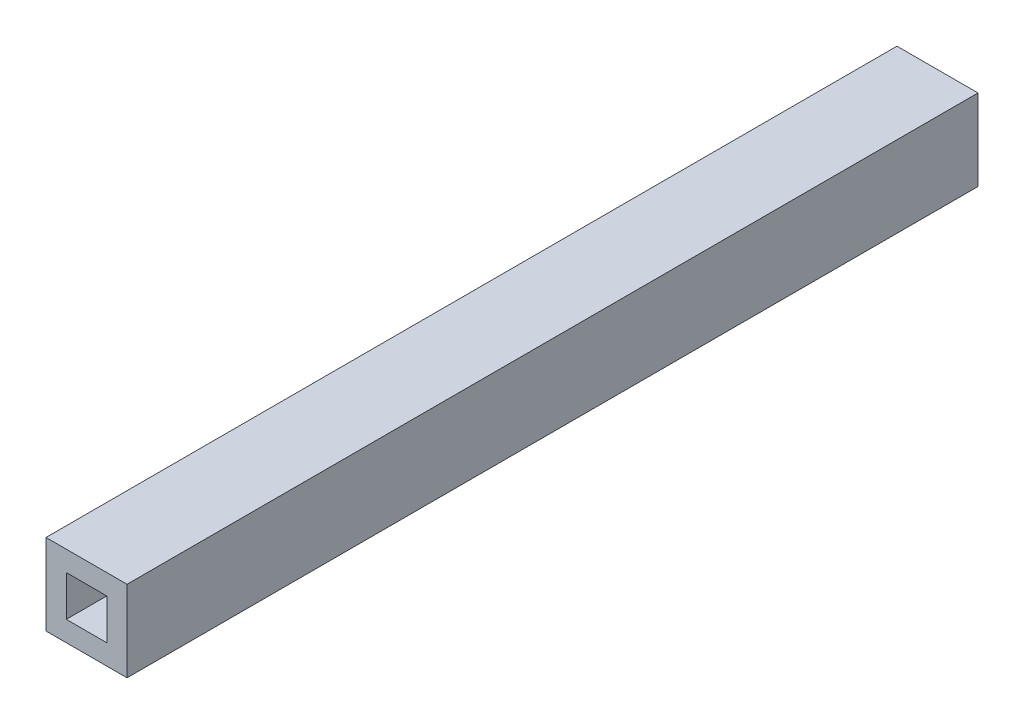
ISO-10303-21;
HEADER;
FILE_DESCRIPTION(('STEP AP214'),'2;1');
FILE_NAME('part.step','',(''),(''),'','','');
FILE_SCHEMA(('AUTOMOTIVE_DESIGN { 1 0 10303 214 1 1 1 1 }'));
ENDSEC;
DATA;
#1=APPLICATION_CONTEXT('core data for automotive mechanical design processes');
#2=APPLICATION_PROTOCOL_DEFINITION('international standard','automotive_design',2000,#1);
#3=PRODUCT_CONTEXT('',#1,'mechanical');
#4=PRODUCT('Part','Part','',(#3));
#5=PRODUCT_RELATED_PRODUCT_CATEGORY('part','',(#4));
#6=PRODUCT_DEFINITION_FORMATION('','',#4);
#7=PRODUCT_DEFINITION_CONTEXT('part definition',#1,'design');
#8=PRODUCT_DEFINITION('design','',#6,#7);
#9=PRODUCT_DEFINITION_SHAPE('','',#8);
#10=(LENGTH_UNIT() NAMED_UNIT(*) SI_UNIT(.MILLI.,.METRE.));
#11=(NAMED_UNIT(*) PLANE_ANGLE_UNIT() SI_UNIT($,.RADIAN.));
#12=(NAMED_UNIT(*) SI_UNIT($,.STERADIAN.) SOLID_ANGLE_UNIT());
#13=UNCERTAINTY_MEASURE_WITH_UNIT(LENGTH_MEASURE(1.E-05),#10,'distance_accuracy_value','');
#14=(GEOMETRIC_REPRESENTATION_CONTEXT(3) GLOBAL_UNCERTAINTY_ASSIGNED_CONTEXT((#13)) GLOBAL_UNIT_ASSIGNED_CONTEXT((#10,
#11,#12)) REPRESENTATION_CONTEXT('',''));
#15=CARTESIAN_POINT('',(0.,0.,0.));
#16=DIRECTION('',(0.,0.,1.));
#17=DIRECTION('',(1.,0.,0.));
#18=AXIS2_PLACEMENT_3D('',#15,#16,#17);
#19=CARTESIAN_POINT('',(0.,0.,210.));
#20=DIRECTION('',(0.,0.,1.));
#21=DIRECTION('',(1.,0.,0.));
#22=AXIS2_PLACEMENT_3D('',#19,#20,#21);
#23=PLANE('',#22);
#24=DIRECTION('',(0.,1.,0.));
#25=VECTOR('',#24,1.);
#26=CARTESIAN_POINT('',(10.,-10.,210.));
#27=LINE('',#26,#25);
#28=CARTESIAN_POINT('',(10.,-10.,210.));
#29=VERTEX_POINT('',#28);
#30=CARTESIAN_POINT('',(10.,10.,210.));
#31=VERTEX_POINT('',#30);
#32=EDGE_CURVE('E158',#29,#31,#27,.T.);
#33=ORIENTED_EDGE('',*,*,#32,.T.);
#34=DIRECTION('',(-1.,0.,0.));
#35=VECTOR('',#34,1.);
#36=CARTESIAN_POINT('',(-10.,10.,210.));
#37=LINE('',#36,#35);
#38=CARTESIAN_POINT('',(-10.,10.,210.));
#39=VERTEX_POINT('',#38);
#40=EDGE_CURVE('E161',#31,#39,#37,.T.);
#41=ORIENTED_EDGE('',*,*,#40,.T.);
#42=DIRECTION('',(0.,-1.,0.));
#43=VECTOR('',#42,1.);
#44=CARTESIAN_POINT('',(-10.,-10.,210.));
#45=LINE('',#44,#43);
#46=CARTESIAN_POINT('',(-10.,-10.,210.));
#47=VERTEX_POINT('',#46);
#48=EDGE_CURVE('E164',#39,#47,#45,.T.);
#49=ORIENTED_EDGE('',*,*,#48,.T.);
#50=DIRECTION('',(1.,0.,0.));
#51=VECTOR('',#50,1.);
#52=CARTESIAN_POINT('',(-10.,-10.,210.));
#53=LINE('',#52,#51);
#54=EDGE_CURVE('E166',#47,#29,#53,.T.);
#55=ORIENTED_EDGE('',*,*,#54,.T.);
#56=EDGE_LOOP('',(#33,#41,#49,#55));
#57=FACE_BOUND('',#56,.T.);
#58=DIRECTION('',(-1.,0.,0.));
#59=VECTOR('',#58,1.);
#60=CARTESIAN_POINT('',(0.,5.,210.));
#61=LINE('',#60,#59);
#62=CARTESIAN_POINT('',(5.,5.,210.));
#63=VERTEX_POINT('',#62);
#64=CARTESIAN_POINT('',(-5.,5.,210.));
#65=VERTEX_POINT('',#64);
#66=EDGE_CURVE('E130',#63,#65,#61,.T.);
#67=ORIENTED_EDGE('',*,*,#66,.F.);
#68=DIRECTION('',(0.,1.,0.));
#69=VECTOR('',#68,1.);
#70=CARTESIAN_POINT('',(5.,0.,210.));
#71=LINE('',#70,#69);
#72=CARTESIAN_POINT('',(5.,-5.,210.));
#73=VERTEX_POINT('',#72);
#74=EDGE_CURVE('E122',#73,#63,#71,.T.);
#75=ORIENTED_EDGE('',*,*,#74,.F.);
#76=DIRECTION('',(1.,0.,0.));
#77=VECTOR('',#76,1.);
#78=CARTESIAN_POINT('',(0.,-5.,210.));
#79=LINE('',#78,#77);
#80=CARTESIAN_POINT('',(-5.,-5.,210.));
#81=VERTEX_POINT('',#80);
#82=EDGE_CURVE('E144',#81,#73,#79,.T.);
#83=ORIENTED_EDGE('',*,*,#82,.F.);
#84=DIRECTION('',(0.,-1.,0.));
#85=VECTOR('',#84,1.);
#86=CARTESIAN_POINT('',(-5.,0.,210.));
#87=LINE('',#86,#85);
#88=EDGE_CURVE('E142',#65,#81,#87,.T.);
#89=ORIENTED_EDGE('',*,*,#88,.F.);
#90=EDGE_LOOP('',(#67,#75,#83,#89));
#91=FACE_BOUND('',#90,.T.);
#92=ADVANCED_FACE('F57',(#57,#91),#23,.T.);
#93=CARTESIAN_POINT('',(0.,0.,0.));
#94=DIRECTION('',(0.,0.,1.));
#95=DIRECTION('',(1.,0.,0.));
#96=AXIS2_PLACEMENT_3D('',#93,#94,#95);
#97=PLANE('',#96);
#98=DIRECTION('',(0.,1.,0.));
#99=VECTOR('',#98,1.);
#100=CARTESIAN_POINT('',(10.,-10.,0.));
#101=LINE('',#100,#99);
#102=CARTESIAN_POINT('',(10.,-10.,0.));
#103=VERTEX_POINT('',#102);
#104=CARTESIAN_POINT('',(10.,10.,0.));
#105=VERTEX_POINT('',#104);
#106=EDGE_CURVE('E138',#103,#105,#101,.T.);
#107=ORIENTED_EDGE('',*,*,#106,.F.);
#108=DIRECTION('',(1.,0.,0.));
#109=VECTOR('',#108,1.);
#110=CARTESIAN_POINT('',(-10.,-10.,0.));
#111=LINE('',#110,#109);
#112=CARTESIAN_POINT('',(-10.,-10.,0.));
#113=VERTEX_POINT('',#112);
#114=EDGE_CURVE('E162',#113,#103,#111,.T.);
#115=ORIENTED_EDGE('',*,*,#114,.F.);
#116=DIRECTION('',(0.,-1.,0.));
#117=VECTOR('',#116,1.);
#118=CARTESIAN_POINT('',(-10.,-10.,0.));
#119=LINE('',#118,#117);
#120=CARTESIAN_POINT('',(-10.,10.,0.));
#121=VERTEX_POINT('',#120);
#122=EDGE_CURVE('E173',#121,#113,#119,.T.);
#123=ORIENTED_EDGE('',*,*,#122,.F.);
#124=DIRECTION('',(-1.,0.,0.));
#125=VECTOR('',#124,1.);
#126=CARTESIAN_POINT('',(-10.,10.,0.));
#127=LINE('',#126,#125);
#128=EDGE_CURVE('E171',#105,#121,#127,.T.);
#129=ORIENTED_EDGE('',*,*,#128,.F.);
#130=EDGE_LOOP('',(#107,#115,#123,#129));
#131=FACE_BOUND('',#130,.T.);
#132=DIRECTION('',(0.,1.,0.));
#133=VECTOR('',#132,1.);
#134=CARTESIAN_POINT('',(5.,0.,0.));
#135=LINE('',#134,#133);
#136=CARTESIAN_POINT('',(5.,-5.,0.));
#137=VERTEX_POINT('',#136);
#138=CARTESIAN_POINT('',(5.,5.,0.));
#139=VERTEX_POINT('',#138);
#140=EDGE_CURVE('E80',#137,#139,#135,.T.);
#141=ORIENTED_EDGE('',*,*,#140,.T.);
#142=DIRECTION('',(-1.,0.,0.));
#143=VECTOR('',#142,1.);
#144=CARTESIAN_POINT('',(0.,5.,0.));
#145=LINE('',#144,#143);
#146=CARTESIAN_POINT('',(-5.,5.,0.));
#147=VERTEX_POINT('',#146);
#148=EDGE_CURVE('E137',#139,#147,#145,.T.);
#149=ORIENTED_EDGE('',*,*,#148,.T.);
#150=DIRECTION('',(0.,-1.,0.));
#151=VECTOR('',#150,1.);
#152=CARTESIAN_POINT('',(-5.,0.,0.));
#153=LINE('',#152,#151);
#154=CARTESIAN_POINT('',(-5.,-5.,0.));
#155=VERTEX_POINT('',#154);
#156=EDGE_CURVE('E150',#147,#155,#153,.T.);
#157=ORIENTED_EDGE('',*,*,#156,.T.);
#158=DIRECTION('',(1.,0.,0.));
#159=VECTOR('',#158,1.);
#160=CARTESIAN_POINT('',(0.,-5.,0.));
#161=LINE('',#160,#159);
#162=EDGE_CURVE('E131',#155,#137,#161,.T.);
#163=ORIENTED_EDGE('',*,*,#162,.T.);
#164=EDGE_LOOP('',(#141,#149,#157,#163));
#165=FACE_BOUND('',#164,.T.);
#166=ADVANCED_FACE('F191',(#131,#165),#97,.F.);
#167=CARTESIAN_POINT('',(10.,-10.,210.));
#168=DIRECTION('',(-1.,0.,0.));
#169=DIRECTION('',(0.,0.,1.));
#170=AXIS2_PLACEMENT_3D('',#167,#168,#169);
#171=PLANE('',#170);
#172=ORIENTED_EDGE('',*,*,#106,.T.);
#173=DIRECTION('',(0.,0.,-1.));
#174=VECTOR('',#173,1.);
#175=CARTESIAN_POINT('',(10.,10.,210.));
#176=LINE('',#175,#174);
#177=EDGE_CURVE('E12',#31,#105,#176,.T.);
#178=ORIENTED_EDGE('',*,*,#177,.F.);
#179=ORIENTED_EDGE('',*,*,#32,.F.);
#180=DIRECTION('',(0.,0.,-1.));
#181=VECTOR('',#180,1.);
#182=CARTESIAN_POINT('',(10.,-10.,210.));
#183=LINE('',#182,#181);
#184=EDGE_CURVE('E168',#29,#103,#183,.T.);
#185=ORIENTED_EDGE('',*,*,#184,.T.);
#186=EDGE_LOOP('',(#172,#178,#179,#185));
#187=FACE_BOUND('',#186,.T.);
#188=ADVANCED_FACE('F59',(#187),#171,.F.);
#189=CARTESIAN_POINT('',(-10.,10.,210.));
#190=DIRECTION('',(0.,-1.,0.));
#191=DIRECTION('',(0.,0.,-1.));
#192=AXIS2_PLACEMENT_3D('',#189,#190,#191);
#193=PLANE('',#192);
#194=ORIENTED_EDGE('',*,*,#128,.T.);
#195=DIRECTION('',(0.,0.,-1.));
#196=VECTOR('',#195,1.);
#197=CARTESIAN_POINT('',(-10.,10.,210.));
#198=LINE('',#197,#196);
#199=EDGE_CURVE('E65',#39,#121,#198,.T.);
#200=ORIENTED_EDGE('',*,*,#199,.F.);
#201=ORIENTED_EDGE('',*,*,#40,.F.);
#202=ORIENTED_EDGE('',*,*,#177,.T.);
#203=EDGE_LOOP('',(#194,#200,#201,#202));
#204=FACE_BOUND('',#203,.T.);
#205=ADVANCED_FACE('F201',(#204),#193,.F.);
#206=CARTESIAN_POINT('',(-10.,-10.,210.));
#207=DIRECTION('',(1.,0.,0.));
#208=DIRECTION('',(0.,0.,-1.));
#209=AXIS2_PLACEMENT_3D('',#206,#207,#208);
#210=PLANE('',#209);
#211=ORIENTED_EDGE('',*,*,#122,.T.);
#212=DIRECTION('',(0.,0.,-1.));
#213=VECTOR('',#212,1.);
#214=CARTESIAN_POINT('',(-10.,-10.,210.));
#215=LINE('',#214,#213);
#216=EDGE_CURVE('E178',#47,#113,#215,.T.);
#217=ORIENTED_EDGE('',*,*,#216,.F.);
#218=ORIENTED_EDGE('',*,*,#48,.F.);
#219=ORIENTED_EDGE('',*,*,#199,.T.);
#220=EDGE_LOOP('',(#211,#217,#218,#219));
#221=FACE_BOUND('',#220,.T.);
#222=ADVANCED_FACE('F185',(#221),#210,.F.);
#223=CARTESIAN_POINT('',(-10.,-10.,210.));
#224=DIRECTION('',(0.,1.,0.));
#225=DIRECTION('',(0.,0.,1.));
#226=AXIS2_PLACEMENT_3D('',#223,#224,#225);
#227=PLANE('',#226);
#228=ORIENTED_EDGE('',*,*,#114,.T.);
#229=ORIENTED_EDGE('',*,*,#184,.F.);
#230=ORIENTED_EDGE('',*,*,#54,.F.);
#231=ORIENTED_EDGE('',*,*,#216,.T.);
#232=EDGE_LOOP('',(#228,#229,#230,#231));
#233=FACE_BOUND('',#232,.T.);
#234=ADVANCED_FACE('F195',(#233),#227,.F.);
#235=CARTESIAN_POINT('',(5.,0.,210.));
#236=DIRECTION('',(-1.,0.,0.));
#237=DIRECTION('',(0.,0.,1.));
#238=AXIS2_PLACEMENT_3D('',#235,#236,#237);
#239=PLANE('',#238);
#240=ORIENTED_EDGE('',*,*,#140,.F.);
#241=DIRECTION('',(0.,0.,-1.));
#242=VECTOR('',#241,1.);
#243=CARTESIAN_POINT('',(5.,-5.,210.));
#244=LINE('',#243,#242);
#245=EDGE_CURVE('E126',#73,#137,#244,.T.);
#246=ORIENTED_EDGE('',*,*,#245,.F.);
#247=ORIENTED_EDGE('',*,*,#74,.T.);
#248=DIRECTION('',(0.,0.,-1.));
#249=VECTOR('',#248,1.);
#250=CARTESIAN_POINT('',(5.,5.,210.));
#251=LINE('',#250,#249);
#252=EDGE_CURVE('E125',#63,#139,#251,.T.);
#253=ORIENTED_EDGE('',*,*,#252,.T.);
#254=EDGE_LOOP('',(#240,#246,#247,#253));
#255=FACE_BOUND('',#254,.T.);
#256=ADVANCED_FACE('F124',(#255),#239,.T.);
#257=CARTESIAN_POINT('',(0.,5.,210.));
#258=DIRECTION('',(0.,-1.,0.));
#259=DIRECTION('',(0.,0.,-1.));
#260=AXIS2_PLACEMENT_3D('',#257,#258,#259);
#261=PLANE('',#260);
#262=ORIENTED_EDGE('',*,*,#148,.F.);
#263=ORIENTED_EDGE('',*,*,#252,.F.);
#264=ORIENTED_EDGE('',*,*,#66,.T.);
#265=DIRECTION('',(0.,0.,-1.));
#266=VECTOR('',#265,1.);
#267=CARTESIAN_POINT('',(-5.,5.,210.));
#268=LINE('',#267,#266);
#269=EDGE_CURVE('E139',#65,#147,#268,.T.);
#270=ORIENTED_EDGE('',*,*,#269,.T.);
#271=EDGE_LOOP('',(#262,#263,#264,#270));
#272=FACE_BOUND('',#271,.T.);
#273=ADVANCED_FACE('F134',(#272),#261,.T.);
#274=CARTESIAN_POINT('',(-5.,0.,210.));
#275=DIRECTION('',(1.,0.,0.));
#276=DIRECTION('',(0.,0.,-1.));
#277=AXIS2_PLACEMENT_3D('',#274,#275,#276);
#278=PLANE('',#277);
#279=ORIENTED_EDGE('',*,*,#156,.F.);
#280=ORIENTED_EDGE('',*,*,#269,.F.);
#281=ORIENTED_EDGE('',*,*,#88,.T.);
#282=DIRECTION('',(0.,0.,-1.));
#283=VECTOR('',#282,1.);
#284=CARTESIAN_POINT('',(-5.,-5.,210.));
#285=LINE('',#284,#283);
#286=EDGE_CURVE('E72',#81,#155,#285,.T.);
#287=ORIENTED_EDGE('',*,*,#286,.T.);
#288=EDGE_LOOP('',(#279,#280,#281,#287));
#289=FACE_BOUND('',#288,.T.);
#290=ADVANCED_FACE('F224',(#289),#278,.T.);
#291=CARTESIAN_POINT('',(0.,-5.,210.));
#292=DIRECTION('',(0.,1.,0.));
#293=DIRECTION('',(0.,0.,1.));
#294=AXIS2_PLACEMENT_3D('',#291,#292,#293);
#295=PLANE('',#294);
#296=ORIENTED_EDGE('',*,*,#162,.F.);
#297=ORIENTED_EDGE('',*,*,#286,.F.);
#298=ORIENTED_EDGE('',*,*,#82,.T.);
#299=ORIENTED_EDGE('',*,*,#245,.T.);
#300=EDGE_LOOP('',(#296,#297,#298,#299));
#301=FACE_BOUND('',#300,.T.);
#302=ADVANCED_FACE('F228',(#301),#295,.T.);
#303=CLOSED_SHELL('',(#92,#166,#188,#205,#222,#234,#256,#273,#290,#302));
#304=MANIFOLD_SOLID_BREP('B2',#303);
#305=ADVANCED_BREP_SHAPE_REPRESENTATION('',(#18,#304),#14);
#306=SHAPE_DEFINITION_REPRESENTATION(#9,#305);
ENDSEC;
END-ISO-10303-21;
